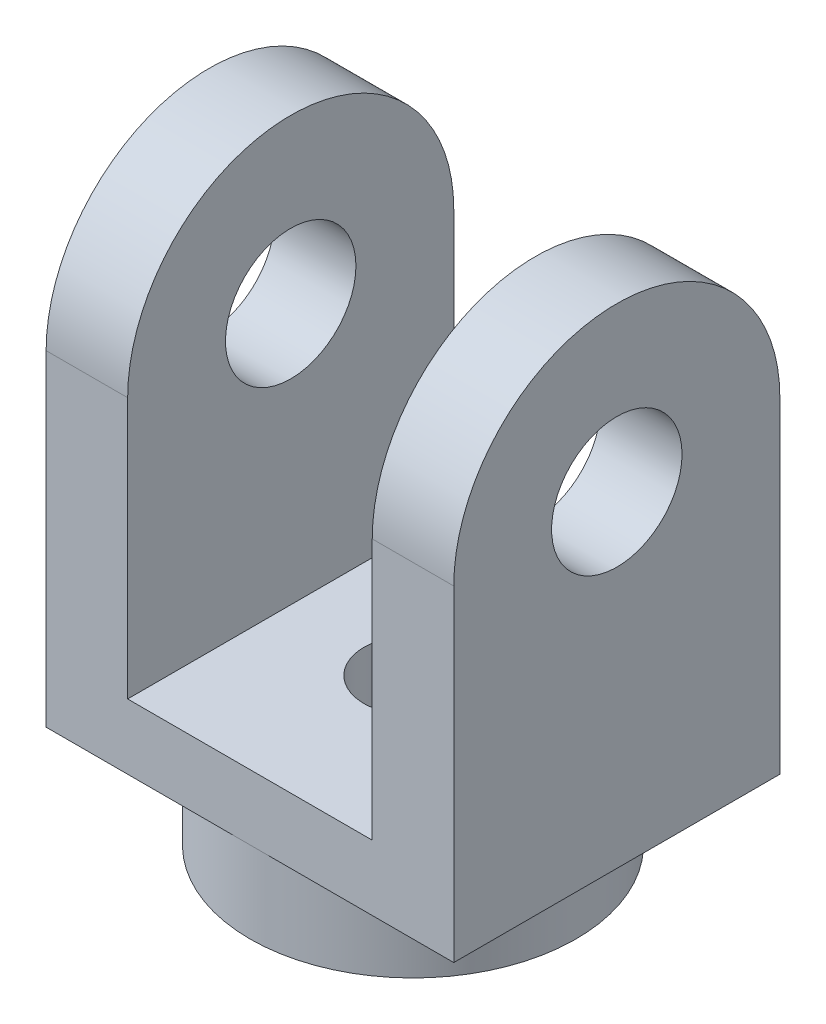
ISO-10303-21;
HEADER;
FILE_DESCRIPTION(('STEP AP214'),'2;1');
FILE_NAME('part.step','',(''),(''),'','','');
FILE_SCHEMA(('AUTOMOTIVE_DESIGN { 1 0 10303 214 1 1 1 1 }'));
ENDSEC;
DATA;
#1=APPLICATION_CONTEXT('core data for automotive mechanical design processes');
#2=APPLICATION_PROTOCOL_DEFINITION('international standard','automotive_design',2000,#1);
#3=PRODUCT_CONTEXT('',#1,'mechanical');
#4=PRODUCT('Part','Part','',(#3));
#5=PRODUCT_RELATED_PRODUCT_CATEGORY('part','',(#4));
#6=PRODUCT_DEFINITION_FORMATION('','',#4);
#7=PRODUCT_DEFINITION_CONTEXT('part definition',#1,'design');
#8=PRODUCT_DEFINITION('design','',#6,#7);
#9=PRODUCT_DEFINITION_SHAPE('','',#8);
#10=(LENGTH_UNIT() NAMED_UNIT(*) SI_UNIT(.MILLI.,.METRE.));
#11=(NAMED_UNIT(*) PLANE_ANGLE_UNIT() SI_UNIT($,.RADIAN.));
#12=(NAMED_UNIT(*) SI_UNIT($,.STERADIAN.) SOLID_ANGLE_UNIT());
#13=UNCERTAINTY_MEASURE_WITH_UNIT(LENGTH_MEASURE(1.E-05),#10,'distance_accuracy_value','');
#14=(GEOMETRIC_REPRESENTATION_CONTEXT(3) GLOBAL_UNCERTAINTY_ASSIGNED_CONTEXT((#13)) GLOBAL_UNIT_ASSIGNED_CONTEXT((#10,
#11,#12)) REPRESENTATION_CONTEXT('',''));
#15=CARTESIAN_POINT('',(0.,0.,0.));
#16=DIRECTION('',(0.,0.,1.));
#17=DIRECTION('',(1.,0.,0.));
#18=AXIS2_PLACEMENT_3D('',#15,#16,#17);
#19=CARTESIAN_POINT('',(62.5,100.,0.));
#20=DIRECTION('',(-1.,0.,0.));
#21=DIRECTION('',(0.,0.,1.));
#22=AXIS2_PLACEMENT_3D('',#19,#20,#21);
#23=CYLINDRICAL_SURFACE('',#22,50.);
#24=CARTESIAN_POINT('',(-37.5,100.,0.));
#25=DIRECTION('',(-1.,0.,0.));
#26=DIRECTION('',(0.,-1.,0.));
#27=AXIS2_PLACEMENT_3D('',#24,#25,#26);
#28=CIRCLE('',#27,50.);
#29=CARTESIAN_POINT('',(-37.5,100.,50.));
#30=VERTEX_POINT('',#29);
#31=CARTESIAN_POINT('',(-37.5,100.,-50.));
#32=VERTEX_POINT('',#31);
#33=EDGE_CURVE('E227',#30,#32,#28,.T.);
#34=ORIENTED_EDGE('',*,*,#33,.T.);
#35=DIRECTION('',(-1.,0.,0.));
#36=VECTOR('',#35,1.);
#37=CARTESIAN_POINT('',(62.5,100.,-50.));
#38=LINE('',#37,#36);
#39=CARTESIAN_POINT('',(-62.5,100.,-50.));
#40=VERTEX_POINT('',#39);
#41=EDGE_CURVE('E137',#32,#40,#38,.T.);
#42=ORIENTED_EDGE('',*,*,#41,.T.);
#43=CARTESIAN_POINT('',(-62.5,100.,0.));
#44=DIRECTION('',(1.,0.,0.));
#45=DIRECTION('',(0.,0.,-1.));
#46=AXIS2_PLACEMENT_3D('',#43,#44,#45);
#47=CIRCLE('',#46,50.);
#48=CARTESIAN_POINT('',(-62.5,100.,50.));
#49=VERTEX_POINT('',#48);
#50=EDGE_CURVE('E209',#40,#49,#47,.T.);
#51=ORIENTED_EDGE('',*,*,#50,.T.);
#52=DIRECTION('',(-1.,0.,0.));
#53=VECTOR('',#52,1.);
#54=CARTESIAN_POINT('',(62.5,100.,50.));
#55=LINE('',#54,#53);
#56=EDGE_CURVE('E153',#30,#49,#55,.T.);
#57=ORIENTED_EDGE('',*,*,#56,.F.);
#58=EDGE_LOOP('',(#34,#42,#51,#57));
#59=FACE_BOUND('',#58,.T.);
#60=ADVANCED_FACE('F43',(#59),#23,.T.);
#61=CARTESIAN_POINT('',(0.,-25.,0.));
#62=DIRECTION('',(0.,1.,0.));
#63=DIRECTION('',(0.,0.,1.));
#64=AXIS2_PLACEMENT_3D('',#61,#62,#63);
#65=CYLINDRICAL_SURFACE('',#64,37.5);
#66=CARTESIAN_POINT('',(0.,-25.,0.));
#67=DIRECTION('',(0.,1.,0.));
#68=DIRECTION('',(0.,0.,1.));
#69=AXIS2_PLACEMENT_3D('',#66,#67,#68);
#70=CIRCLE('',#69,37.5);
#71=CARTESIAN_POINT('',(0.,-25.,37.5));
#72=VERTEX_POINT('',#71);
#73=EDGE_CURVE('E157',#72,#72,#70,.T.);
#74=ORIENTED_EDGE('',*,*,#73,.F.);
#75=EDGE_LOOP('',(#74));
#76=FACE_BOUND('',#75,.T.);
#77=CARTESIAN_POINT('',(0.,0.,0.));
#78=DIRECTION('',(0.,1.,0.));
#79=DIRECTION('',(0.,0.,1.));
#80=AXIS2_PLACEMENT_3D('',#77,#78,#79);
#81=CIRCLE('',#80,37.5);
#82=CARTESIAN_POINT('',(0.,0.,37.5));
#83=VERTEX_POINT('',#82);
#84=EDGE_CURVE('E151',#83,#83,#81,.T.);
#85=ORIENTED_EDGE('',*,*,#84,.T.);
#86=EDGE_LOOP('',(#85));
#87=FACE_BOUND('',#86,.T.);
#88=ADVANCED_FACE('F45',(#76,#87),#65,.F.);
#89=CARTESIAN_POINT('',(0.,-25.,0.));
#90=DIRECTION('',(0.,1.,0.));
#91=DIRECTION('',(0.,0.,1.));
#92=AXIS2_PLACEMENT_3D('',#89,#90,#91);
#93=CYLINDRICAL_SURFACE('',#92,50.);
#94=CARTESIAN_POINT('',(0.,-25.,0.));
#95=DIRECTION('',(0.,1.,0.));
#96=DIRECTION('',(0.,0.,1.));
#97=AXIS2_PLACEMENT_3D('',#94,#95,#96);
#98=CIRCLE('',#97,50.);
#99=CARTESIAN_POINT('',(0.,-25.,50.));
#100=VERTEX_POINT('',#99);
#101=EDGE_CURVE('E53',#100,#100,#98,.T.);
#102=ORIENTED_EDGE('',*,*,#101,.T.);
#103=EDGE_LOOP('',(#102));
#104=FACE_BOUND('',#103,.T.);
#105=CARTESIAN_POINT('',(0.,0.,0.));
#106=DIRECTION('',(0.,1.,0.));
#107=DIRECTION('',(0.,0.,1.));
#108=AXIS2_PLACEMENT_3D('',#105,#106,#107);
#109=CIRCLE('',#108,50.);
#110=CARTESIAN_POINT('',(0.,0.,50.));
#111=VERTEX_POINT('',#110);
#112=CARTESIAN_POINT('',(0.,0.,-50.));
#113=VERTEX_POINT('',#112);
#114=EDGE_CURVE('E161',#111,#113,#109,.T.);
#115=ORIENTED_EDGE('',*,*,#114,.F.);
#116=EDGE_CURVE('E67',#113,#111,#109,.T.);
#117=ORIENTED_EDGE('',*,*,#116,.F.);
#118=EDGE_LOOP('',(#115,#117));
#119=FACE_BOUND('',#118,.T.);
#120=ADVANCED_FACE('F292',(#104,#119),#93,.T.);
#121=CARTESIAN_POINT('',(0.,-25.,0.));
#122=DIRECTION('',(0.,1.,0.));
#123=DIRECTION('',(0.,0.,1.));
#124=AXIS2_PLACEMENT_3D('',#121,#122,#123);
#125=PLANE('',#124);
#126=ORIENTED_EDGE('',*,*,#73,.T.);
#127=EDGE_LOOP('',(#126));
#128=FACE_BOUND('',#127,.T.);
#129=ORIENTED_EDGE('',*,*,#101,.F.);
#130=EDGE_LOOP('',(#129));
#131=FACE_BOUND('',#130,.T.);
#132=ADVANCED_FACE('F325',(#128,#131),#125,.F.);
#133=CARTESIAN_POINT('',(-62.5,100.,0.));
#134=DIRECTION('',(1.,0.,0.));
#135=DIRECTION('',(0.,0.,-1.));
#136=AXIS2_PLACEMENT_3D('',#133,#134,#135);
#137=PLANE('',#136);
#138=CARTESIAN_POINT('',(-62.5,100.,0.));
#139=DIRECTION('',(1.,0.,0.));
#140=DIRECTION('',(0.,0.,-1.));
#141=AXIS2_PLACEMENT_3D('',#138,#139,#140);
#142=CIRCLE('',#141,20.);
#143=CARTESIAN_POINT('',(-62.5,100.,-20.));
#144=VERTEX_POINT('',#143);
#145=EDGE_CURVE('E260',#144,#144,#142,.T.);
#146=ORIENTED_EDGE('',*,*,#145,.T.);
#147=EDGE_LOOP('',(#146));
#148=FACE_BOUND('',#147,.T.);
#149=DIRECTION('',(0.,1.,0.));
#150=VECTOR('',#149,1.);
#151=CARTESIAN_POINT('',(-62.5,0.,-50.));
#152=LINE('',#151,#150);
#153=CARTESIAN_POINT('',(-62.5,0.,-50.));
#154=VERTEX_POINT('',#153);
#155=EDGE_CURVE('E139',#154,#40,#152,.T.);
#156=ORIENTED_EDGE('',*,*,#155,.F.);
#157=DIRECTION('',(0.,0.,-1.));
#158=VECTOR('',#157,1.);
#159=CARTESIAN_POINT('',(-62.5,0.,50.));
#160=LINE('',#159,#158);
#161=CARTESIAN_POINT('',(-62.5,0.,50.));
#162=VERTEX_POINT('',#161);
#163=EDGE_CURVE('E203',#162,#154,#160,.T.);
#164=ORIENTED_EDGE('',*,*,#163,.F.);
#165=DIRECTION('',(0.,-1.,0.));
#166=VECTOR('',#165,1.);
#167=CARTESIAN_POINT('',(-62.5,100.,50.));
#168=LINE('',#167,#166);
#169=EDGE_CURVE('E191',#49,#162,#168,.T.);
#170=ORIENTED_EDGE('',*,*,#169,.F.);
#171=ORIENTED_EDGE('',*,*,#50,.F.);
#172=EDGE_LOOP('',(#156,#164,#170,#171));
#173=FACE_BOUND('',#172,.T.);
#174=ADVANCED_FACE('F321',(#148,#173),#137,.F.);
#175=CARTESIAN_POINT('',(62.5,100.,0.));
#176=DIRECTION('',(1.,0.,0.));
#177=DIRECTION('',(0.,0.,-1.));
#178=AXIS2_PLACEMENT_3D('',#175,#176,#177);
#179=PLANE('',#178);
#180=CARTESIAN_POINT('',(62.5,100.,0.));
#181=DIRECTION('',(1.,0.,0.));
#182=DIRECTION('',(0.,0.,-1.));
#183=AXIS2_PLACEMENT_3D('',#180,#181,#182);
#184=CIRCLE('',#183,20.);
#185=CARTESIAN_POINT('',(62.5,100.,-20.));
#186=VERTEX_POINT('',#185);
#187=EDGE_CURVE('E256',#186,#186,#184,.T.);
#188=ORIENTED_EDGE('',*,*,#187,.F.);
#189=EDGE_LOOP('',(#188));
#190=FACE_BOUND('',#189,.T.);
#191=DIRECTION('',(0.,1.,0.));
#192=VECTOR('',#191,1.);
#193=CARTESIAN_POINT('',(62.5,0.,-50.));
#194=LINE('',#193,#192);
#195=CARTESIAN_POINT('',(62.5,0.,-50.));
#196=VERTEX_POINT('',#195);
#197=CARTESIAN_POINT('',(62.5,100.,-50.));
#198=VERTEX_POINT('',#197);
#199=EDGE_CURVE('E206',#196,#198,#194,.T.);
#200=ORIENTED_EDGE('',*,*,#199,.T.);
#201=CARTESIAN_POINT('',(62.5,100.,0.));
#202=DIRECTION('',(1.,0.,0.));
#203=DIRECTION('',(0.,0.,-1.));
#204=AXIS2_PLACEMENT_3D('',#201,#202,#203);
#205=CIRCLE('',#204,50.);
#206=CARTESIAN_POINT('',(62.5,100.,50.));
#207=VERTEX_POINT('',#206);
#208=EDGE_CURVE('E219',#198,#207,#205,.T.);
#209=ORIENTED_EDGE('',*,*,#208,.T.);
#210=DIRECTION('',(0.,-1.,0.));
#211=VECTOR('',#210,1.);
#212=CARTESIAN_POINT('',(62.5,100.,50.));
#213=LINE('',#212,#211);
#214=CARTESIAN_POINT('',(62.5,0.,50.));
#215=VERTEX_POINT('',#214);
#216=EDGE_CURVE('E216',#207,#215,#213,.T.);
#217=ORIENTED_EDGE('',*,*,#216,.T.);
#218=DIRECTION('',(0.,0.,-1.));
#219=VECTOR('',#218,1.);
#220=CARTESIAN_POINT('',(62.5,0.,50.));
#221=LINE('',#220,#219);
#222=EDGE_CURVE('E196',#215,#196,#221,.T.);
#223=ORIENTED_EDGE('',*,*,#222,.T.);
#224=EDGE_LOOP('',(#200,#209,#217,#223));
#225=FACE_BOUND('',#224,.T.);
#226=ADVANCED_FACE('F302',(#190,#225),#179,.T.);
#227=CARTESIAN_POINT('',(62.5,100.,50.));
#228=DIRECTION('',(0.,0.,-1.));
#229=DIRECTION('',(0.,1.,0.));
#230=AXIS2_PLACEMENT_3D('',#227,#228,#229);
#231=PLANE('',#230);
#232=DIRECTION('',(-1.,0.,0.));
#233=VECTOR('',#232,1.);
#234=CARTESIAN_POINT('',(62.5,20.,50.));
#235=LINE('',#234,#233);
#236=CARTESIAN_POINT('',(37.5,20.,50.));
#237=VERTEX_POINT('',#236);
#238=CARTESIAN_POINT('',(-37.5,20.,50.));
#239=VERTEX_POINT('',#238);
#240=EDGE_CURVE('E238',#237,#239,#235,.T.);
#241=ORIENTED_EDGE('',*,*,#240,.T.);
#242=DIRECTION('',(0.,1.,0.));
#243=VECTOR('',#242,1.);
#244=CARTESIAN_POINT('',(-37.5,100.,50.));
#245=LINE('',#244,#243);
#246=EDGE_CURVE('E122',#239,#30,#245,.T.);
#247=ORIENTED_EDGE('',*,*,#246,.T.);
#248=ORIENTED_EDGE('',*,*,#56,.T.);
#249=ORIENTED_EDGE('',*,*,#169,.T.);
#250=DIRECTION('',(-1.,0.,0.));
#251=VECTOR('',#250,1.);
#252=CARTESIAN_POINT('',(62.5,0.,50.));
#253=LINE('',#252,#251);
#254=EDGE_CURVE('E180',#111,#162,#253,.T.);
#255=ORIENTED_EDGE('',*,*,#254,.F.);
#256=EDGE_CURVE('E188',#215,#111,#253,.T.);
#257=ORIENTED_EDGE('',*,*,#256,.F.);
#258=ORIENTED_EDGE('',*,*,#216,.F.);
#259=CARTESIAN_POINT('',(37.5,100.,50.));
#260=VERTEX_POINT('',#259);
#261=EDGE_CURVE('E145',#207,#260,#55,.T.);
#262=ORIENTED_EDGE('',*,*,#261,.T.);
#263=DIRECTION('',(0.,-1.,0.));
#264=VECTOR('',#263,1.);
#265=CARTESIAN_POINT('',(37.5,100.,50.));
#266=LINE('',#265,#264);
#267=EDGE_CURVE('E230',#260,#237,#266,.T.);
#268=ORIENTED_EDGE('',*,*,#267,.T.);
#269=EDGE_LOOP('',(#241,#247,#248,#249,#255,#257,#258,#262,#268));
#270=FACE_BOUND('',#269,.T.);
#271=ADVANCED_FACE('F186',(#270),#231,.F.);
#272=CARTESIAN_POINT('',(37.5,100.,-50.));
#273=VERTEX_POINT('',#272);
#274=EDGE_CURVE('E144',#198,#273,#38,.T.);
#275=ORIENTED_EDGE('',*,*,#274,.T.);
#276=CARTESIAN_POINT('',(37.5,100.,0.));
#277=DIRECTION('',(1.,0.,0.));
#278=DIRECTION('',(0.,1.,0.));
#279=AXIS2_PLACEMENT_3D('',#276,#277,#278);
#280=CIRCLE('',#279,50.);
#281=EDGE_CURVE('E234',#273,#260,#280,.T.);
#282=ORIENTED_EDGE('',*,*,#281,.T.);
#283=ORIENTED_EDGE('',*,*,#261,.F.);
#284=ORIENTED_EDGE('',*,*,#208,.F.);
#285=EDGE_LOOP('',(#275,#282,#283,#284));
#286=FACE_BOUND('',#285,.T.);
#287=ADVANCED_FACE('F288',(#286),#23,.T.);
#288=CARTESIAN_POINT('',(62.5,0.,-50.));
#289=DIRECTION('',(0.,0.,1.));
#290=DIRECTION('',(1.,0.,0.));
#291=AXIS2_PLACEMENT_3D('',#288,#289,#290);
#292=PLANE('',#291);
#293=ORIENTED_EDGE('',*,*,#41,.F.);
#294=DIRECTION('',(0.,-1.,0.));
#295=VECTOR('',#294,1.);
#296=CARTESIAN_POINT('',(-37.5,0.,-50.));
#297=LINE('',#296,#295);
#298=CARTESIAN_POINT('',(-37.5,20.,-50.));
#299=VERTEX_POINT('',#298);
#300=EDGE_CURVE('E11',#32,#299,#297,.T.);
#301=ORIENTED_EDGE('',*,*,#300,.T.);
#302=DIRECTION('',(1.,0.,0.));
#303=VECTOR('',#302,1.);
#304=CARTESIAN_POINT('',(-37.5,20.,-50.));
#305=LINE('',#304,#303);
#306=CARTESIAN_POINT('',(37.5,20.,-50.));
#307=VERTEX_POINT('',#306);
#308=EDGE_CURVE('E129',#299,#307,#305,.T.);
#309=ORIENTED_EDGE('',*,*,#308,.T.);
#310=DIRECTION('',(0.,1.,0.));
#311=VECTOR('',#310,1.);
#312=CARTESIAN_POINT('',(37.5,150.,-50.));
#313=LINE('',#312,#311);
#314=EDGE_CURVE('E60',#307,#273,#313,.T.);
#315=ORIENTED_EDGE('',*,*,#314,.T.);
#316=ORIENTED_EDGE('',*,*,#274,.F.);
#317=ORIENTED_EDGE('',*,*,#199,.F.);
#318=DIRECTION('',(-1.,0.,0.));
#319=VECTOR('',#318,1.);
#320=CARTESIAN_POINT('',(62.5,0.,-50.));
#321=LINE('',#320,#319);
#322=EDGE_CURVE('E194',#196,#113,#321,.T.);
#323=ORIENTED_EDGE('',*,*,#322,.T.);
#324=EDGE_CURVE('E182',#113,#154,#321,.T.);
#325=ORIENTED_EDGE('',*,*,#324,.T.);
#326=ORIENTED_EDGE('',*,*,#155,.T.);
#327=EDGE_LOOP('',(#293,#301,#309,#315,#316,#317,#323,#325,#326));
#328=FACE_BOUND('',#327,.T.);
#329=ADVANCED_FACE('F135',(#328),#292,.F.);
#330=CARTESIAN_POINT('',(62.5,0.,50.));
#331=DIRECTION('',(0.,1.,0.));
#332=DIRECTION('',(0.,0.,1.));
#333=AXIS2_PLACEMENT_3D('',#330,#331,#332);
#334=PLANE('',#333);
#335=ORIENTED_EDGE('',*,*,#324,.F.);
#336=ORIENTED_EDGE('',*,*,#116,.T.);
#337=ORIENTED_EDGE('',*,*,#254,.T.);
#338=ORIENTED_EDGE('',*,*,#163,.T.);
#339=EDGE_LOOP('',(#335,#336,#337,#338));
#340=FACE_BOUND('',#339,.T.);
#341=ADVANCED_FACE('F178',(#340),#334,.F.);
#342=ORIENTED_EDGE('',*,*,#256,.T.);
#343=ORIENTED_EDGE('',*,*,#114,.T.);
#344=ORIENTED_EDGE('',*,*,#322,.F.);
#345=ORIENTED_EDGE('',*,*,#222,.F.);
#346=EDGE_LOOP('',(#342,#343,#344,#345));
#347=FACE_BOUND('',#346,.T.);
#348=ADVANCED_FACE('F195',(#347),#334,.F.);
#349=CARTESIAN_POINT('',(0.,0.,0.));
#350=DIRECTION('',(0.,1.,0.));
#351=DIRECTION('',(0.,0.,1.));
#352=AXIS2_PLACEMENT_3D('',#349,#350,#351);
#353=CIRCLE('',#352,15.);
#354=CARTESIAN_POINT('',(0.,0.,15.));
#355=VERTEX_POINT('',#354);
#356=EDGE_CURVE('E133',#355,#355,#353,.T.);
#357=ORIENTED_EDGE('',*,*,#356,.T.);
#358=EDGE_LOOP('',(#357));
#359=FACE_BOUND('',#358,.T.);
#360=ORIENTED_EDGE('',*,*,#84,.F.);
#361=EDGE_LOOP('',(#360));
#362=FACE_BOUND('',#361,.T.);
#363=ADVANCED_FACE('F315',(#359,#362),#334,.F.);
#364=CARTESIAN_POINT('',(-37.5,150.,-50.));
#365=DIRECTION('',(-1.,0.,0.));
#366=DIRECTION('',(0.,-1.,0.));
#367=AXIS2_PLACEMENT_3D('',#364,#365,#366);
#368=PLANE('',#367);
#369=CARTESIAN_POINT('',(-37.5,100.,0.));
#370=DIRECTION('',(-1.,0.,0.));
#371=DIRECTION('',(0.,-1.,0.));
#372=AXIS2_PLACEMENT_3D('',#369,#370,#371);
#373=CIRCLE('',#372,20.);
#374=CARTESIAN_POINT('',(-37.5,80.,0.));
#375=VERTEX_POINT('',#374);
#376=EDGE_CURVE('E252',#375,#375,#373,.T.);
#377=ORIENTED_EDGE('',*,*,#376,.T.);
#378=EDGE_LOOP('',(#377));
#379=FACE_BOUND('',#378,.T.);
#380=DIRECTION('',(0.,0.,1.));
#381=VECTOR('',#380,1.);
#382=CARTESIAN_POINT('',(-37.5,20.,-50.));
#383=LINE('',#382,#381);
#384=EDGE_CURVE('E117',#299,#239,#383,.T.);
#385=ORIENTED_EDGE('',*,*,#384,.F.);
#386=ORIENTED_EDGE('',*,*,#300,.F.);
#387=ORIENTED_EDGE('',*,*,#33,.F.);
#388=ORIENTED_EDGE('',*,*,#246,.F.);
#389=EDGE_LOOP('',(#385,#386,#387,#388));
#390=FACE_BOUND('',#389,.T.);
#391=ADVANCED_FACE('F119',(#379,#390),#368,.F.);
#392=CARTESIAN_POINT('',(37.5,150.,-50.));
#393=DIRECTION('',(1.,0.,0.));
#394=DIRECTION('',(0.,1.,0.));
#395=AXIS2_PLACEMENT_3D('',#392,#393,#394);
#396=PLANE('',#395);
#397=CARTESIAN_POINT('',(37.5,100.,0.));
#398=DIRECTION('',(1.,0.,0.));
#399=DIRECTION('',(0.,1.,0.));
#400=AXIS2_PLACEMENT_3D('',#397,#398,#399);
#401=CIRCLE('',#400,20.);
#402=CARTESIAN_POINT('',(37.5,120.,0.));
#403=VERTEX_POINT('',#402);
#404=EDGE_CURVE('E47',#403,#403,#401,.T.);
#405=ORIENTED_EDGE('',*,*,#404,.T.);
#406=EDGE_LOOP('',(#405));
#407=FACE_BOUND('',#406,.T.);
#408=ORIENTED_EDGE('',*,*,#281,.F.);
#409=ORIENTED_EDGE('',*,*,#314,.F.);
#410=DIRECTION('',(0.,0.,1.));
#411=VECTOR('',#410,1.);
#412=CARTESIAN_POINT('',(37.5,20.,-50.));
#413=LINE('',#412,#411);
#414=EDGE_CURVE('E126',#307,#237,#413,.T.);
#415=ORIENTED_EDGE('',*,*,#414,.T.);
#416=ORIENTED_EDGE('',*,*,#267,.F.);
#417=EDGE_LOOP('',(#408,#409,#415,#416));
#418=FACE_BOUND('',#417,.T.);
#419=ADVANCED_FACE('F271',(#407,#418),#396,.F.);
#420=CARTESIAN_POINT('',(-37.5,20.,-50.));
#421=DIRECTION('',(0.,-1.,0.));
#422=DIRECTION('',(1.,0.,0.));
#423=AXIS2_PLACEMENT_3D('',#420,#421,#422);
#424=PLANE('',#423);
#425=CARTESIAN_POINT('',(0.,20.,0.));
#426=DIRECTION('',(0.,1.,0.));
#427=DIRECTION('',(-1.,0.,0.));
#428=AXIS2_PLACEMENT_3D('',#425,#426,#427);
#429=CIRCLE('',#428,15.);
#430=CARTESIAN_POINT('',(-15.,20.,0.));
#431=VERTEX_POINT('',#430);
#432=EDGE_CURVE('E248',#431,#431,#429,.T.);
#433=ORIENTED_EDGE('',*,*,#432,.F.);
#434=EDGE_LOOP('',(#433));
#435=FACE_BOUND('',#434,.T.);
#436=ORIENTED_EDGE('',*,*,#414,.F.);
#437=ORIENTED_EDGE('',*,*,#308,.F.);
#438=ORIENTED_EDGE('',*,*,#384,.T.);
#439=ORIENTED_EDGE('',*,*,#240,.F.);
#440=EDGE_LOOP('',(#436,#437,#438,#439));
#441=FACE_BOUND('',#440,.T.);
#442=ADVANCED_FACE('F130',(#435,#441),#424,.F.);
#443=CARTESIAN_POINT('',(0.,-25.,0.));
#444=DIRECTION('',(0.,1.,0.));
#445=DIRECTION('',(-1.,0.,0.));
#446=AXIS2_PLACEMENT_3D('',#443,#444,#445);
#447=CYLINDRICAL_SURFACE('',#446,15.);
#448=ORIENTED_EDGE('',*,*,#432,.T.);
#449=EDGE_LOOP('',(#448));
#450=FACE_BOUND('',#449,.T.);
#451=ORIENTED_EDGE('',*,*,#356,.F.);
#452=EDGE_LOOP('',(#451));
#453=FACE_BOUND('',#452,.T.);
#454=ADVANCED_FACE('F276',(#450,#453),#447,.F.);
#455=CARTESIAN_POINT('',(-62.5,100.,0.));
#456=DIRECTION('',(1.,0.,0.));
#457=DIRECTION('',(0.,0.,-1.));
#458=AXIS2_PLACEMENT_3D('',#455,#456,#457);
#459=CYLINDRICAL_SURFACE('',#458,20.);
#460=ORIENTED_EDGE('',*,*,#187,.T.);
#461=EDGE_LOOP('',(#460));
#462=FACE_BOUND('',#461,.T.);
#463=ORIENTED_EDGE('',*,*,#404,.F.);
#464=EDGE_LOOP('',(#463));
#465=FACE_BOUND('',#464,.T.);
#466=ADVANCED_FACE('F273',(#462,#465),#459,.F.);
#467=ORIENTED_EDGE('',*,*,#145,.F.);
#468=EDGE_LOOP('',(#467));
#469=FACE_BOUND('',#468,.T.);
#470=ORIENTED_EDGE('',*,*,#376,.F.);
#471=EDGE_LOOP('',(#470));
#472=FACE_BOUND('',#471,.T.);
#473=ADVANCED_FACE('F275',(#469,#472),#459,.F.);
#474=CLOSED_SHELL('',(#60,#88,#120,#132,#174,#226,#271,#287,#329,#341,#348,#363,#391,#419,#442,
#454,#466,#473));
#475=MANIFOLD_SOLID_BREP('B2',#474);
#476=ADVANCED_BREP_SHAPE_REPRESENTATION('',(#18,#475),#14);
#477=SHAPE_DEFINITION_REPRESENTATION(#9,#476);
ENDSEC;
END-ISO-10303-21;
